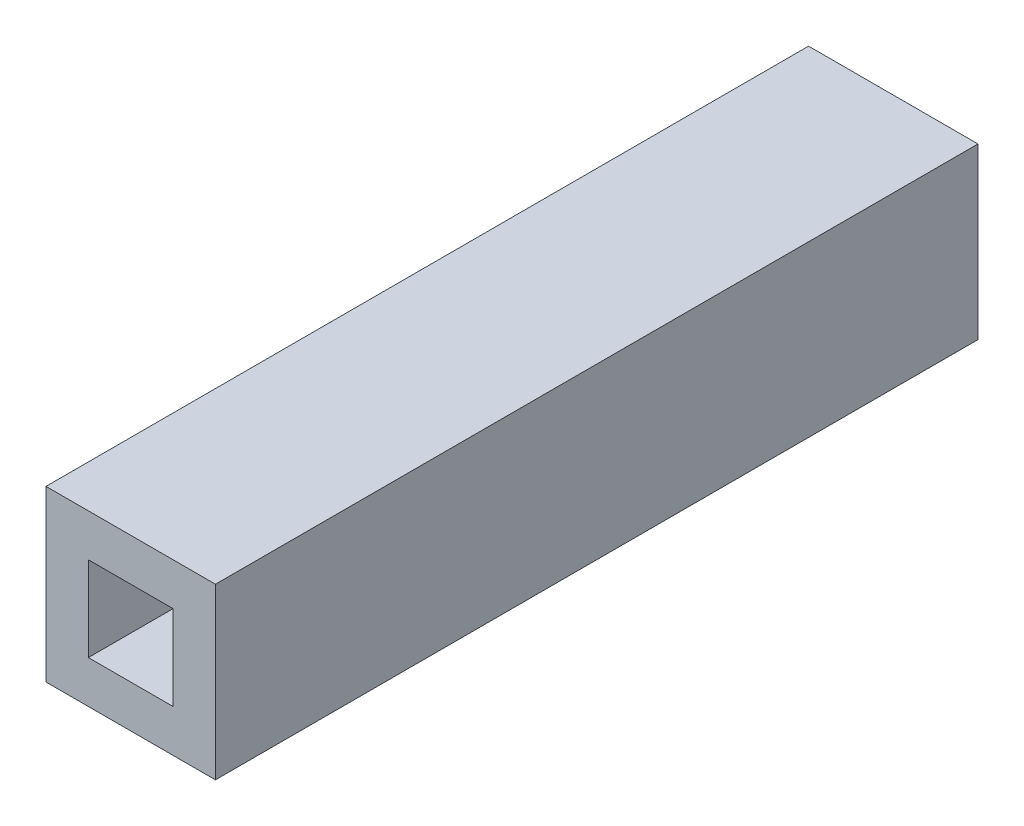
ISO-10303-21;
HEADER;
FILE_DESCRIPTION(('STEP AP214'),'2;1');
FILE_NAME('part.step','',(''),(''),'','','');
FILE_SCHEMA(('AUTOMOTIVE_DESIGN { 1 0 10303 214 1 1 1 1 }'));
ENDSEC;
DATA;
#1=APPLICATION_CONTEXT('core data for automotive mechanical design processes');
#2=APPLICATION_PROTOCOL_DEFINITION('international standard','automotive_design',2000,#1);
#3=PRODUCT_CONTEXT('',#1,'mechanical');
#4=PRODUCT('Part','Part','',(#3));
#5=PRODUCT_RELATED_PRODUCT_CATEGORY('part','',(#4));
#6=PRODUCT_DEFINITION_FORMATION('','',#4);
#7=PRODUCT_DEFINITION_CONTEXT('part definition',#1,'design');
#8=PRODUCT_DEFINITION('design','',#6,#7);
#9=PRODUCT_DEFINITION_SHAPE('','',#8);
#10=(LENGTH_UNIT() NAMED_UNIT(*) SI_UNIT(.MILLI.,.METRE.));
#11=(NAMED_UNIT(*) PLANE_ANGLE_UNIT() SI_UNIT($,.RADIAN.));
#12=(NAMED_UNIT(*) SI_UNIT($,.STERADIAN.) SOLID_ANGLE_UNIT());
#13=UNCERTAINTY_MEASURE_WITH_UNIT(LENGTH_MEASURE(1.E-05),#10,'distance_accuracy_value','');
#14=(GEOMETRIC_REPRESENTATION_CONTEXT(3) GLOBAL_UNCERTAINTY_ASSIGNED_CONTEXT((#13)) GLOBAL_UNIT_ASSIGNED_CONTEXT((#10,
#11,#12)) REPRESENTATION_CONTEXT('',''));
#15=CARTESIAN_POINT('',(0.,0.,0.));
#16=DIRECTION('',(0.,0.,1.));
#17=DIRECTION('',(1.,0.,0.));
#18=AXIS2_PLACEMENT_3D('',#15,#16,#17);
#19=CARTESIAN_POINT('',(0.,0.,90.));
#20=DIRECTION('',(0.,0.,1.));
#21=DIRECTION('',(1.,0.,0.));
#22=AXIS2_PLACEMENT_3D('',#19,#20,#21);
#23=PLANE('',#22);
#24=DIRECTION('',(0.,1.,0.));
#25=VECTOR('',#24,1.);
#26=CARTESIAN_POINT('',(10.,-10.,90.));
#27=LINE('',#26,#25);
#28=CARTESIAN_POINT('',(10.,-10.,90.));
#29=VERTEX_POINT('',#28);
#30=CARTESIAN_POINT('',(10.,10.,90.));
#31=VERTEX_POINT('',#30);
#32=EDGE_CURVE('E158',#29,#31,#27,.T.);
#33=ORIENTED_EDGE('',*,*,#32,.T.);
#34=DIRECTION('',(-1.,0.,0.));
#35=VECTOR('',#34,1.);
#36=CARTESIAN_POINT('',(-10.,10.,90.));
#37=LINE('',#36,#35);
#38=CARTESIAN_POINT('',(-10.,10.,90.));
#39=VERTEX_POINT('',#38);
#40=EDGE_CURVE('E161',#31,#39,#37,.T.);
#41=ORIENTED_EDGE('',*,*,#40,.T.);
#42=DIRECTION('',(0.,-1.,0.));
#43=VECTOR('',#42,1.);
#44=CARTESIAN_POINT('',(-10.,-10.,90.));
#45=LINE('',#44,#43);
#46=CARTESIAN_POINT('',(-10.,-10.,90.));
#47=VERTEX_POINT('',#46);
#48=EDGE_CURVE('E164',#39,#47,#45,.T.);
#49=ORIENTED_EDGE('',*,*,#48,.T.);
#50=DIRECTION('',(1.,0.,0.));
#51=VECTOR('',#50,1.);
#52=CARTESIAN_POINT('',(-10.,-10.,90.));
#53=LINE('',#52,#51);
#54=EDGE_CURVE('E166',#47,#29,#53,.T.);
#55=ORIENTED_EDGE('',*,*,#54,.T.);
#56=EDGE_LOOP('',(#33,#41,#49,#55));
#57=FACE_BOUND('',#56,.T.);
#58=DIRECTION('',(-1.,0.,0.));
#59=VECTOR('',#58,1.);
#60=CARTESIAN_POINT('',(0.,5.,90.));
#61=LINE('',#60,#59);
#62=CARTESIAN_POINT('',(5.,5.,90.));
#63=VERTEX_POINT('',#62);
#64=CARTESIAN_POINT('',(-5.,5.,90.));
#65=VERTEX_POINT('',#64);
#66=EDGE_CURVE('E130',#63,#65,#61,.T.);
#67=ORIENTED_EDGE('',*,*,#66,.F.);
#68=DIRECTION('',(0.,1.,0.));
#69=VECTOR('',#68,1.);
#70=CARTESIAN_POINT('',(5.,0.,90.));
#71=LINE('',#70,#69);
#72=CARTESIAN_POINT('',(5.,-5.,90.));
#73=VERTEX_POINT('',#72);
#74=EDGE_CURVE('E122',#73,#63,#71,.T.);
#75=ORIENTED_EDGE('',*,*,#74,.F.);
#76=DIRECTION('',(1.,0.,0.));
#77=VECTOR('',#76,1.);
#78=CARTESIAN_POINT('',(0.,-5.,90.));
#79=LINE('',#78,#77);
#80=CARTESIAN_POINT('',(-5.,-5.,90.));
#81=VERTEX_POINT('',#80);
#82=EDGE_CURVE('E144',#81,#73,#79,.T.);
#83=ORIENTED_EDGE('',*,*,#82,.F.);
#84=DIRECTION('',(0.,-1.,0.));
#85=VECTOR('',#84,1.);
#86=CARTESIAN_POINT('',(-5.,0.,90.));
#87=LINE('',#86,#85);
#88=EDGE_CURVE('E142',#65,#81,#87,.T.);
#89=ORIENTED_EDGE('',*,*,#88,.F.);
#90=EDGE_LOOP('',(#67,#75,#83,#89));
#91=FACE_BOUND('',#90,.T.);
#92=ADVANCED_FACE('F57',(#57,#91),#23,.T.);
#93=CARTESIAN_POINT('',(0.,0.,0.));
#94=DIRECTION('',(0.,0.,1.));
#95=DIRECTION('',(1.,0.,0.));
#96=AXIS2_PLACEMENT_3D('',#93,#94,#95);
#97=PLANE('',#96);
#98=DIRECTION('',(0.,1.,0.));
#99=VECTOR('',#98,1.);
#100=CARTESIAN_POINT('',(10.,-10.,0.));
#101=LINE('',#100,#99);
#102=CARTESIAN_POINT('',(10.,-10.,0.));
#103=VERTEX_POINT('',#102);
#104=CARTESIAN_POINT('',(10.,10.,0.));
#105=VERTEX_POINT('',#104);
#106=EDGE_CURVE('E138',#103,#105,#101,.T.);
#107=ORIENTED_EDGE('',*,*,#106,.F.);
#108=DIRECTION('',(1.,0.,0.));
#109=VECTOR('',#108,1.);
#110=CARTESIAN_POINT('',(-10.,-10.,0.));
#111=LINE('',#110,#109);
#112=CARTESIAN_POINT('',(-10.,-10.,0.));
#113=VERTEX_POINT('',#112);
#114=EDGE_CURVE('E162',#113,#103,#111,.T.);
#115=ORIENTED_EDGE('',*,*,#114,.F.);
#116=DIRECTION('',(0.,-1.,0.));
#117=VECTOR('',#116,1.);
#118=CARTESIAN_POINT('',(-10.,-10.,0.));
#119=LINE('',#118,#117);
#120=CARTESIAN_POINT('',(-10.,10.,0.));
#121=VERTEX_POINT('',#120);
#122=EDGE_CURVE('E173',#121,#113,#119,.T.);
#123=ORIENTED_EDGE('',*,*,#122,.F.);
#124=DIRECTION('',(-1.,0.,0.));
#125=VECTOR('',#124,1.);
#126=CARTESIAN_POINT('',(-10.,10.,0.));
#127=LINE('',#126,#125);
#128=EDGE_CURVE('E171',#105,#121,#127,.T.);
#129=ORIENTED_EDGE('',*,*,#128,.F.);
#130=EDGE_LOOP('',(#107,#115,#123,#129));
#131=FACE_BOUND('',#130,.T.);
#132=DIRECTION('',(0.,1.,0.));
#133=VECTOR('',#132,1.);
#134=CARTESIAN_POINT('',(5.,0.,0.));
#135=LINE('',#134,#133);
#136=CARTESIAN_POINT('',(5.,-5.,0.));
#137=VERTEX_POINT('',#136);
#138=CARTESIAN_POINT('',(5.,5.,0.));
#139=VERTEX_POINT('',#138);
#140=EDGE_CURVE('E80',#137,#139,#135,.T.);
#141=ORIENTED_EDGE('',*,*,#140,.T.);
#142=DIRECTION('',(-1.,0.,0.));
#143=VECTOR('',#142,1.);
#144=CARTESIAN_POINT('',(0.,5.,0.));
#145=LINE('',#144,#143);
#146=CARTESIAN_POINT('',(-5.,5.,0.));
#147=VERTEX_POINT('',#146);
#148=EDGE_CURVE('E137',#139,#147,#145,.T.);
#149=ORIENTED_EDGE('',*,*,#148,.T.);
#150=DIRECTION('',(0.,-1.,0.));
#151=VECTOR('',#150,1.);
#152=CARTESIAN_POINT('',(-5.,0.,0.));
#153=LINE('',#152,#151);
#154=CARTESIAN_POINT('',(-5.,-5.,0.));
#155=VERTEX_POINT('',#154);
#156=EDGE_CURVE('E150',#147,#155,#153,.T.);
#157=ORIENTED_EDGE('',*,*,#156,.T.);
#158=DIRECTION('',(1.,0.,0.));
#159=VECTOR('',#158,1.);
#160=CARTESIAN_POINT('',(0.,-5.,0.));
#161=LINE('',#160,#159);
#162=EDGE_CURVE('E131',#155,#137,#161,.T.);
#163=ORIENTED_EDGE('',*,*,#162,.T.);
#164=EDGE_LOOP('',(#141,#149,#157,#163));
#165=FACE_BOUND('',#164,.T.);
#166=ADVANCED_FACE('F191',(#131,#165),#97,.F.);
#167=CARTESIAN_POINT('',(10.,-10.,90.));
#168=DIRECTION('',(-1.,0.,0.));
#169=DIRECTION('',(0.,0.,1.));
#170=AXIS2_PLACEMENT_3D('',#167,#168,#169);
#171=PLANE('',#170);
#172=ORIENTED_EDGE('',*,*,#106,.T.);
#173=DIRECTION('',(0.,0.,-1.));
#174=VECTOR('',#173,1.);
#175=CARTESIAN_POINT('',(10.,10.,90.));
#176=LINE('',#175,#174);
#177=EDGE_CURVE('E12',#31,#105,#176,.T.);
#178=ORIENTED_EDGE('',*,*,#177,.F.);
#179=ORIENTED_EDGE('',*,*,#32,.F.);
#180=DIRECTION('',(0.,0.,-1.));
#181=VECTOR('',#180,1.);
#182=CARTESIAN_POINT('',(10.,-10.,90.));
#183=LINE('',#182,#181);
#184=EDGE_CURVE('E168',#29,#103,#183,.T.);
#185=ORIENTED_EDGE('',*,*,#184,.T.);
#186=EDGE_LOOP('',(#172,#178,#179,#185));
#187=FACE_BOUND('',#186,.T.);
#188=ADVANCED_FACE('F59',(#187),#171,.F.);
#189=CARTESIAN_POINT('',(-10.,10.,90.));
#190=DIRECTION('',(0.,-1.,0.));
#191=DIRECTION('',(0.,0.,-1.));
#192=AXIS2_PLACEMENT_3D('',#189,#190,#191);
#193=PLANE('',#192);
#194=ORIENTED_EDGE('',*,*,#128,.T.);
#195=DIRECTION('',(0.,0.,-1.));
#196=VECTOR('',#195,1.);
#197=CARTESIAN_POINT('',(-10.,10.,90.));
#198=LINE('',#197,#196);
#199=EDGE_CURVE('E65',#39,#121,#198,.T.);
#200=ORIENTED_EDGE('',*,*,#199,.F.);
#201=ORIENTED_EDGE('',*,*,#40,.F.);
#202=ORIENTED_EDGE('',*,*,#177,.T.);
#203=EDGE_LOOP('',(#194,#200,#201,#202));
#204=FACE_BOUND('',#203,.T.);
#205=ADVANCED_FACE('F201',(#204),#193,.F.);
#206=CARTESIAN_POINT('',(-10.,-10.,90.));
#207=DIRECTION('',(1.,0.,0.));
#208=DIRECTION('',(0.,0.,-1.));
#209=AXIS2_PLACEMENT_3D('',#206,#207,#208);
#210=PLANE('',#209);
#211=ORIENTED_EDGE('',*,*,#122,.T.);
#212=DIRECTION('',(0.,0.,-1.));
#213=VECTOR('',#212,1.);
#214=CARTESIAN_POINT('',(-10.,-10.,90.));
#215=LINE('',#214,#213);
#216=EDGE_CURVE('E178',#47,#113,#215,.T.);
#217=ORIENTED_EDGE('',*,*,#216,.F.);
#218=ORIENTED_EDGE('',*,*,#48,.F.);
#219=ORIENTED_EDGE('',*,*,#199,.T.);
#220=EDGE_LOOP('',(#211,#217,#218,#219));
#221=FACE_BOUND('',#220,.T.);
#222=ADVANCED_FACE('F185',(#221),#210,.F.);
#223=CARTESIAN_POINT('',(-10.,-10.,90.));
#224=DIRECTION('',(0.,1.,0.));
#225=DIRECTION('',(0.,0.,1.));
#226=AXIS2_PLACEMENT_3D('',#223,#224,#225);
#227=PLANE('',#226);
#228=ORIENTED_EDGE('',*,*,#114,.T.);
#229=ORIENTED_EDGE('',*,*,#184,.F.);
#230=ORIENTED_EDGE('',*,*,#54,.F.);
#231=ORIENTED_EDGE('',*,*,#216,.T.);
#232=EDGE_LOOP('',(#228,#229,#230,#231));
#233=FACE_BOUND('',#232,.T.);
#234=ADVANCED_FACE('F195',(#233),#227,.F.);
#235=CARTESIAN_POINT('',(5.,0.,90.));
#236=DIRECTION('',(-1.,0.,0.));
#237=DIRECTION('',(0.,0.,1.));
#238=AXIS2_PLACEMENT_3D('',#235,#236,#237);
#239=PLANE('',#238);
#240=ORIENTED_EDGE('',*,*,#140,.F.);
#241=DIRECTION('',(0.,0.,-1.));
#242=VECTOR('',#241,1.);
#243=CARTESIAN_POINT('',(5.,-5.,90.));
#244=LINE('',#243,#242);
#245=EDGE_CURVE('E126',#73,#137,#244,.T.);
#246=ORIENTED_EDGE('',*,*,#245,.F.);
#247=ORIENTED_EDGE('',*,*,#74,.T.);
#248=DIRECTION('',(0.,0.,-1.));
#249=VECTOR('',#248,1.);
#250=CARTESIAN_POINT('',(5.,5.,90.));
#251=LINE('',#250,#249);
#252=EDGE_CURVE('E125',#63,#139,#251,.T.);
#253=ORIENTED_EDGE('',*,*,#252,.T.);
#254=EDGE_LOOP('',(#240,#246,#247,#253));
#255=FACE_BOUND('',#254,.T.);
#256=ADVANCED_FACE('F124',(#255),#239,.T.);
#257=CARTESIAN_POINT('',(0.,5.,90.));
#258=DIRECTION('',(0.,-1.,0.));
#259=DIRECTION('',(0.,0.,-1.));
#260=AXIS2_PLACEMENT_3D('',#257,#258,#259);
#261=PLANE('',#260);
#262=ORIENTED_EDGE('',*,*,#148,.F.);
#263=ORIENTED_EDGE('',*,*,#252,.F.);
#264=ORIENTED_EDGE('',*,*,#66,.T.);
#265=DIRECTION('',(0.,0.,-1.));
#266=VECTOR('',#265,1.);
#267=CARTESIAN_POINT('',(-5.,5.,90.));
#268=LINE('',#267,#266);
#269=EDGE_CURVE('E139',#65,#147,#268,.T.);
#270=ORIENTED_EDGE('',*,*,#269,.T.);
#271=EDGE_LOOP('',(#262,#263,#264,#270));
#272=FACE_BOUND('',#271,.T.);
#273=ADVANCED_FACE('F134',(#272),#261,.T.);
#274=CARTESIAN_POINT('',(-5.,0.,90.));
#275=DIRECTION('',(1.,0.,0.));
#276=DIRECTION('',(0.,0.,-1.));
#277=AXIS2_PLACEMENT_3D('',#274,#275,#276);
#278=PLANE('',#277);
#279=ORIENTED_EDGE('',*,*,#156,.F.);
#280=ORIENTED_EDGE('',*,*,#269,.F.);
#281=ORIENTED_EDGE('',*,*,#88,.T.);
#282=DIRECTION('',(0.,0.,-1.));
#283=VECTOR('',#282,1.);
#284=CARTESIAN_POINT('',(-5.,-5.,90.));
#285=LINE('',#284,#283);
#286=EDGE_CURVE('E72',#81,#155,#285,.T.);
#287=ORIENTED_EDGE('',*,*,#286,.T.);
#288=EDGE_LOOP('',(#279,#280,#281,#287));
#289=FACE_BOUND('',#288,.T.);
#290=ADVANCED_FACE('F224',(#289),#278,.T.);
#291=CARTESIAN_POINT('',(0.,-5.,90.));
#292=DIRECTION('',(0.,1.,0.));
#293=DIRECTION('',(0.,0.,1.));
#294=AXIS2_PLACEMENT_3D('',#291,#292,#293);
#295=PLANE('',#294);
#296=ORIENTED_EDGE('',*,*,#162,.F.);
#297=ORIENTED_EDGE('',*,*,#286,.F.);
#298=ORIENTED_EDGE('',*,*,#82,.T.);
#299=ORIENTED_EDGE('',*,*,#245,.T.);
#300=EDGE_LOOP('',(#296,#297,#298,#299));
#301=FACE_BOUND('',#300,.T.);
#302=ADVANCED_FACE('F228',(#301),#295,.T.);
#303=CLOSED_SHELL('',(#92,#166,#188,#205,#222,#234,#256,#273,#290,#302));
#304=MANIFOLD_SOLID_BREP('B2',#303);
#305=ADVANCED_BREP_SHAPE_REPRESENTATION('',(#18,#304),#14);
#306=SHAPE_DEFINITION_REPRESENTATION(#9,#305);
ENDSEC;
END-ISO-10303-21;
